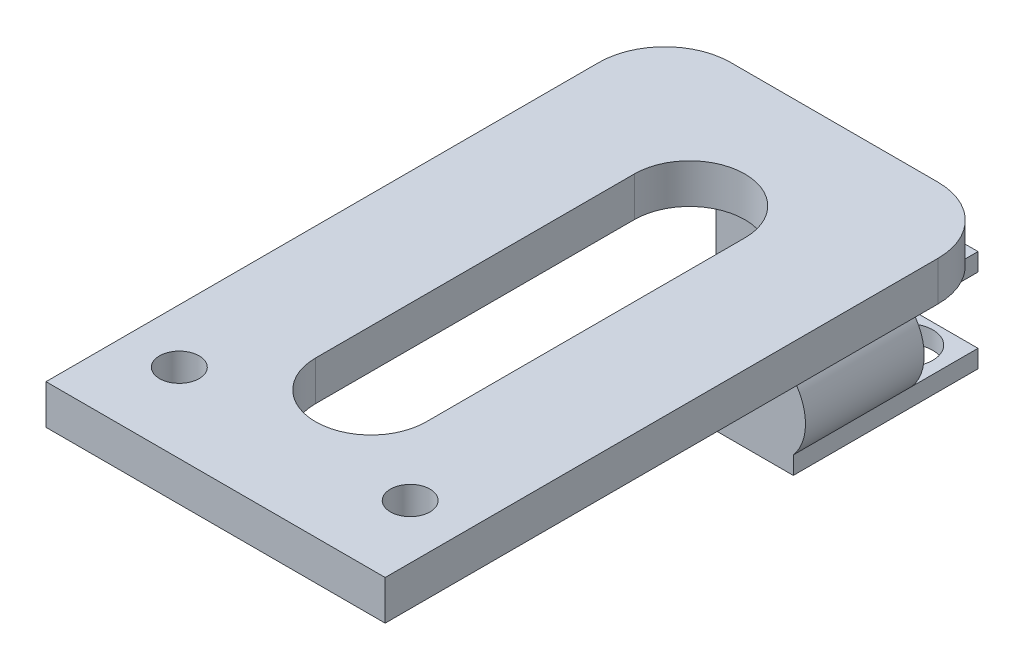
ISO-10303-21;
HEADER;
FILE_DESCRIPTION(('STEP AP214'),'2;1');
FILE_NAME('part.step','',(''),(''),'','','');
FILE_SCHEMA(('AUTOMOTIVE_DESIGN { 1 0 10303 214 1 1 1 1 }'));
ENDSEC;
DATA;
#1=APPLICATION_CONTEXT('core data for automotive mechanical design processes');
#2=APPLICATION_PROTOCOL_DEFINITION('international standard','automotive_design',2000,#1);
#3=PRODUCT_CONTEXT('',#1,'mechanical');
#4=PRODUCT('Part','Part','',(#3));
#5=PRODUCT_RELATED_PRODUCT_CATEGORY('part','',(#4));
#6=PRODUCT_DEFINITION_FORMATION('','',#4);
#7=PRODUCT_DEFINITION_CONTEXT('part definition',#1,'design');
#8=PRODUCT_DEFINITION('design','',#6,#7);
#9=PRODUCT_DEFINITION_SHAPE('','',#8);
#10=(LENGTH_UNIT() NAMED_UNIT(*) SI_UNIT(.MILLI.,.METRE.));
#11=(NAMED_UNIT(*) PLANE_ANGLE_UNIT() SI_UNIT($,.RADIAN.));
#12=(NAMED_UNIT(*) SI_UNIT($,.STERADIAN.) SOLID_ANGLE_UNIT());
#13=UNCERTAINTY_MEASURE_WITH_UNIT(LENGTH_MEASURE(1.E-05),#10,'distance_accuracy_value','');
#14=(GEOMETRIC_REPRESENTATION_CONTEXT(3) GLOBAL_UNCERTAINTY_ASSIGNED_CONTEXT((#13)) GLOBAL_UNIT_ASSIGNED_CONTEXT((#10,
#11,#12)) REPRESENTATION_CONTEXT('',''));
#15=CARTESIAN_POINT('',(0.,0.,0.));
#16=DIRECTION('',(0.,0.,1.));
#17=DIRECTION('',(1.,0.,0.));
#18=AXIS2_PLACEMENT_3D('',#15,#16,#17);
#19=CARTESIAN_POINT('',(2.92617170234072,11.,10.));
#20=DIRECTION('',(0.,-1.,0.));
#21=DIRECTION('',(0.,0.,-1.));
#22=AXIS2_PLACEMENT_3D('',#19,#20,#21);
#23=PLANE('',#22);
#24=CARTESIAN_POINT('',(0.,11.,2.5));
#25=DIRECTION('',(0.,1.,0.));
#26=DIRECTION('',(0.,0.,1.));
#27=AXIS2_PLACEMENT_3D('',#24,#25,#26);
#28=CIRCLE('',#27,2.);
#29=CARTESIAN_POINT('',(0.,11.,4.5));
#30=VERTEX_POINT('',#29);
#31=EDGE_CURVE('E304',#30,#30,#28,.T.);
#32=ORIENTED_EDGE('',*,*,#31,.F.);
#33=EDGE_LOOP('',(#32));
#34=FACE_BOUND('',#33,.T.);
#35=DIRECTION('',(-1.,0.,0.));
#36=VECTOR('',#35,1.);
#37=CARTESIAN_POINT('',(2.92617170234072,11.,9.));
#38=LINE('',#37,#36);
#39=CARTESIAN_POINT('',(2.92617170234072,11.,9.));
#40=VERTEX_POINT('',#39);
#41=CARTESIAN_POINT('',(-2.92617170234077,11.,9.));
#42=VERTEX_POINT('',#41);
#43=EDGE_CURVE('E33',#40,#42,#38,.T.);
#44=ORIENTED_EDGE('',*,*,#43,.F.);
#45=DIRECTION('',(0.,0.,-1.));
#46=VECTOR('',#45,1.);
#47=CARTESIAN_POINT('',(2.92617170234072,11.,10.));
#48=LINE('',#47,#46);
#49=CARTESIAN_POINT('',(2.92617170234072,11.,0.));
#50=VERTEX_POINT('',#49);
#51=EDGE_CURVE('E364',#40,#50,#48,.T.);
#52=ORIENTED_EDGE('',*,*,#51,.T.);
#53=DIRECTION('',(-1.,0.,0.));
#54=VECTOR('',#53,1.);
#55=CARTESIAN_POINT('',(2.92617170234072,11.,0.));
#56=LINE('',#55,#54);
#57=CARTESIAN_POINT('',(-2.92617170234077,11.,0.));
#58=VERTEX_POINT('',#57);
#59=EDGE_CURVE('E359',#50,#58,#56,.T.);
#60=ORIENTED_EDGE('',*,*,#59,.T.);
#61=DIRECTION('',(0.,0.,-1.));
#62=VECTOR('',#61,1.);
#63=CARTESIAN_POINT('',(-2.92617170234077,11.,10.));
#64=LINE('',#63,#62);
#65=EDGE_CURVE('E362',#42,#58,#64,.T.);
#66=ORIENTED_EDGE('',*,*,#65,.F.);
#67=EDGE_LOOP('',(#44,#52,#60,#66));
#68=FACE_BOUND('',#67,.T.);
#69=ADVANCED_FACE('F17',(#34,#68),#23,.F.);
#70=CARTESIAN_POINT('',(-2.92617170234077,11.,10.));
#71=DIRECTION('',(1.,0.,0.));
#72=DIRECTION('',(0.,1.,0.));
#73=AXIS2_PLACEMENT_3D('',#70,#71,#72);
#74=PLANE('',#73);
#75=DIRECTION('',(0.,-1.,0.));
#76=VECTOR('',#75,1.);
#77=CARTESIAN_POINT('',(-2.92617170234077,11.,0.));
#78=LINE('',#77,#76);
#79=CARTESIAN_POINT('',(-2.92617170234077,9.65200303125719,0.));
#80=VERTEX_POINT('',#79);
#81=EDGE_CURVE('E350',#58,#80,#78,.T.);
#82=ORIENTED_EDGE('',*,*,#81,.T.);
#83=DIRECTION('',(0.,0.,-1.));
#84=VECTOR('',#83,1.);
#85=CARTESIAN_POINT('',(-2.92617170234077,9.65200303125719,10.));
#86=LINE('',#85,#84);
#87=CARTESIAN_POINT('',(-2.92617170234077,9.65200303125719,5.));
#88=VERTEX_POINT('',#87);
#89=EDGE_CURVE('E26',#88,#80,#86,.T.);
#90=ORIENTED_EDGE('',*,*,#89,.F.);
#91=CARTESIAN_POINT('',(-2.92617170234077,9.65200303125719,14.));
#92=VERTEX_POINT('',#91);
#93=EDGE_CURVE('E11',#92,#88,#86,.T.);
#94=ORIENTED_EDGE('',*,*,#93,.F.);
#95=DIRECTION('',(0.,-1.,0.));
#96=VECTOR('',#95,1.);
#97=CARTESIAN_POINT('',(-2.92617170234078,0.,14.));
#98=LINE('',#97,#96);
#99=CARTESIAN_POINT('',(-2.92617170234077,19.,14.));
#100=VERTEX_POINT('',#99);
#101=EDGE_CURVE('E283',#100,#92,#98,.T.);
#102=ORIENTED_EDGE('',*,*,#101,.F.);
#103=DIRECTION('',(0.,0.,1.));
#104=VECTOR('',#103,1.);
#105=CARTESIAN_POINT('',(-2.92617170234077,19.,14.));
#106=LINE('',#105,#104);
#107=CARTESIAN_POINT('',(-2.92617170234077,19.,9.));
#108=VERTEX_POINT('',#107);
#109=EDGE_CURVE('E270',#108,#100,#106,.T.);
#110=ORIENTED_EDGE('',*,*,#109,.F.);
#111=DIRECTION('',(0.,-1.,0.));
#112=VECTOR('',#111,1.);
#113=CARTESIAN_POINT('',(-2.92617170234077,19.,9.));
#114=LINE('',#113,#112);
#115=EDGE_CURVE('E276',#108,#42,#114,.T.);
#116=ORIENTED_EDGE('',*,*,#115,.T.);
#117=ORIENTED_EDGE('',*,*,#65,.T.);
#118=EDGE_LOOP('',(#82,#90,#94,#102,#110,#116,#117));
#119=FACE_BOUND('',#118,.T.);
#120=ADVANCED_FACE('F19',(#119),#74,.F.);
#121=CARTESIAN_POINT('',(-2.92617170234077,9.65200303125719,10.));
#122=DIRECTION('',(0.,1.,0.));
#123=DIRECTION('',(0.,0.,1.));
#124=AXIS2_PLACEMENT_3D('',#121,#122,#123);
#125=PLANE('',#124);
#126=CARTESIAN_POINT('',(0.,9.65200303125719,2.5));
#127=DIRECTION('',(0.,1.,0.));
#128=DIRECTION('',(0.,0.,1.));
#129=AXIS2_PLACEMENT_3D('',#126,#127,#128);
#130=CIRCLE('',#129,2.);
#131=CARTESIAN_POINT('',(0.,9.65200303125719,4.5));
#132=VERTEX_POINT('',#131);
#133=EDGE_CURVE('E310',#132,#132,#130,.T.);
#134=ORIENTED_EDGE('',*,*,#133,.T.);
#135=EDGE_LOOP('',(#134));
#136=FACE_BOUND('',#135,.T.);
#137=DIRECTION('',(0.,0.,-1.));
#138=VECTOR('',#137,1.);
#139=CARTESIAN_POINT('',(2.92617170234072,9.65200303125719,10.));
#140=LINE('',#139,#138);
#141=CARTESIAN_POINT('',(2.92617170234072,9.65200303125719,5.));
#142=VERTEX_POINT('',#141);
#143=CARTESIAN_POINT('',(2.92617170234072,9.65200303125719,0.));
#144=VERTEX_POINT('',#143);
#145=EDGE_CURVE('E366',#142,#144,#140,.T.);
#146=ORIENTED_EDGE('',*,*,#145,.F.);
#147=DIRECTION('',(-1.,0.,0.));
#148=VECTOR('',#147,1.);
#149=CARTESIAN_POINT('',(2.92617170234072,9.65200303125719,5.));
#150=LINE('',#149,#148);
#151=EDGE_CURVE('E337',#142,#88,#150,.T.);
#152=ORIENTED_EDGE('',*,*,#151,.T.);
#153=ORIENTED_EDGE('',*,*,#89,.T.);
#154=DIRECTION('',(1.,0.,0.));
#155=VECTOR('',#154,1.);
#156=CARTESIAN_POINT('',(-2.92617170234077,9.65200303125719,0.));
#157=LINE('',#156,#155);
#158=EDGE_CURVE('E353',#80,#144,#157,.T.);
#159=ORIENTED_EDGE('',*,*,#158,.T.);
#160=EDGE_LOOP('',(#146,#152,#153,#159));
#161=FACE_BOUND('',#160,.T.);
#162=ADVANCED_FACE('F377',(#136,#161),#125,.F.);
#163=CARTESIAN_POINT('',(2.92617170234072,9.65200303125719,10.));
#164=DIRECTION('',(-1.,0.,0.));
#165=DIRECTION('',(0.,0.,1.));
#166=AXIS2_PLACEMENT_3D('',#163,#164,#165);
#167=PLANE('',#166);
#168=DIRECTION('',(0.,1.,0.));
#169=VECTOR('',#168,1.);
#170=CARTESIAN_POINT('',(2.92617170234072,9.65200303125719,0.));
#171=LINE('',#170,#169);
#172=EDGE_CURVE('E356',#144,#50,#171,.T.);
#173=ORIENTED_EDGE('',*,*,#172,.T.);
#174=ORIENTED_EDGE('',*,*,#51,.F.);
#175=DIRECTION('',(0.,-1.,0.));
#176=VECTOR('',#175,1.);
#177=CARTESIAN_POINT('',(2.92617170234072,19.,9.));
#178=LINE('',#177,#176);
#179=CARTESIAN_POINT('',(2.92617170234072,19.,9.));
#180=VERTEX_POINT('',#179);
#181=EDGE_CURVE('E280',#180,#40,#178,.T.);
#182=ORIENTED_EDGE('',*,*,#181,.F.);
#183=DIRECTION('',(0.,0.,-1.));
#184=VECTOR('',#183,1.);
#185=CARTESIAN_POINT('',(2.92617170234072,19.,14.));
#186=LINE('',#185,#184);
#187=CARTESIAN_POINT('',(2.92617170234072,19.,14.));
#188=VERTEX_POINT('',#187);
#189=EDGE_CURVE('E264',#188,#180,#186,.T.);
#190=ORIENTED_EDGE('',*,*,#189,.F.);
#191=DIRECTION('',(0.,1.,0.));
#192=VECTOR('',#191,1.);
#193=CARTESIAN_POINT('',(2.92617170234072,0.,14.));
#194=LINE('',#193,#192);
#195=CARTESIAN_POINT('',(2.92617170234072,9.65200303125719,14.));
#196=VERTEX_POINT('',#195);
#197=EDGE_CURVE('E301',#196,#188,#194,.T.);
#198=ORIENTED_EDGE('',*,*,#197,.F.);
#199=EDGE_CURVE('E367',#196,#142,#140,.T.);
#200=ORIENTED_EDGE('',*,*,#199,.T.);
#201=ORIENTED_EDGE('',*,*,#145,.T.);
#202=EDGE_LOOP('',(#173,#174,#182,#190,#198,#200,#201));
#203=FACE_BOUND('',#202,.T.);
#204=ADVANCED_FACE('F372',(#203),#167,.F.);
#205=CARTESIAN_POINT('',(0.,0.,0.));
#206=DIRECTION('',(0.,0.,1.));
#207=DIRECTION('',(1.,0.,0.));
#208=AXIS2_PLACEMENT_3D('',#205,#206,#207);
#209=PLANE('',#208);
#210=ORIENTED_EDGE('',*,*,#81,.F.);
#211=ORIENTED_EDGE('',*,*,#59,.F.);
#212=ORIENTED_EDGE('',*,*,#172,.F.);
#213=ORIENTED_EDGE('',*,*,#158,.F.);
#214=EDGE_LOOP('',(#210,#211,#212,#213));
#215=FACE_BOUND('',#214,.T.);
#216=ADVANCED_FACE('F381',(#215),#209,.F.);
#217=CARTESIAN_POINT('',(0.,7.15,10.));
#218=DIRECTION('',(0.,0.,-1.));
#219=DIRECTION('',(-1.,0.,0.));
#220=AXIS2_PLACEMENT_3D('',#217,#218,#219);
#221=CYLINDRICAL_SURFACE('',#220,3.85);
#222=CARTESIAN_POINT('',(0.,7.15,5.));
#223=DIRECTION('',(0.,0.,1.));
#224=DIRECTION('',(1.,0.,0.));
#225=AXIS2_PLACEMENT_3D('',#222,#223,#224);
#226=CIRCLE('',#225,3.85);
#227=CARTESIAN_POINT('',(2.92617170234072,4.64799696874278,5.));
#228=VERTEX_POINT('',#227);
#229=EDGE_CURVE('E334',#228,#142,#226,.T.);
#230=ORIENTED_EDGE('',*,*,#229,.T.);
#231=ORIENTED_EDGE('',*,*,#199,.F.);
#232=CARTESIAN_POINT('',(0.,7.15,14.));
#233=DIRECTION('',(0.,0.,1.));
#234=DIRECTION('',(1.,0.,0.));
#235=AXIS2_PLACEMENT_3D('',#232,#233,#234);
#236=CIRCLE('',#235,3.85);
#237=CARTESIAN_POINT('',(2.92617170234072,4.64799696874278,14.));
#238=VERTEX_POINT('',#237);
#239=EDGE_CURVE('E298',#238,#196,#236,.T.);
#240=ORIENTED_EDGE('',*,*,#239,.F.);
#241=DIRECTION('',(0.,0.,-1.));
#242=VECTOR('',#241,1.);
#243=CARTESIAN_POINT('',(2.92617170234072,4.64799696874278,10.));
#244=LINE('',#243,#242);
#245=EDGE_CURVE('E344',#238,#228,#244,.T.);
#246=ORIENTED_EDGE('',*,*,#245,.T.);
#247=EDGE_LOOP('',(#230,#231,#240,#246));
#248=FACE_BOUND('',#247,.T.);
#249=ADVANCED_FACE('F394',(#248),#221,.T.);
#250=CARTESIAN_POINT('',(0.,7.15,10.));
#251=DIRECTION('',(0.,0.,-1.));
#252=DIRECTION('',(-1.,0.,0.));
#253=AXIS2_PLACEMENT_3D('',#250,#251,#252);
#254=CYLINDRICAL_SURFACE('',#253,3.85);
#255=CARTESIAN_POINT('',(0.,7.15,5.));
#256=DIRECTION('',(0.,0.,1.));
#257=DIRECTION('',(1.,0.,0.));
#258=AXIS2_PLACEMENT_3D('',#255,#256,#257);
#259=CIRCLE('',#258,3.85);
#260=CARTESIAN_POINT('',(-2.92617170234078,4.64799696874278,5.));
#261=VERTEX_POINT('',#260);
#262=EDGE_CURVE('E41',#88,#261,#259,.T.);
#263=ORIENTED_EDGE('',*,*,#262,.T.);
#264=DIRECTION('',(0.,0.,-1.));
#265=VECTOR('',#264,1.);
#266=CARTESIAN_POINT('',(-2.92617170234078,4.64799696874278,10.));
#267=LINE('',#266,#265);
#268=CARTESIAN_POINT('',(-2.92617170234077,4.64799696874278,14.));
#269=VERTEX_POINT('',#268);
#270=EDGE_CURVE('E347',#269,#261,#267,.T.);
#271=ORIENTED_EDGE('',*,*,#270,.F.);
#272=CARTESIAN_POINT('',(0.,7.15,14.));
#273=DIRECTION('',(0.,0.,1.));
#274=DIRECTION('',(1.,0.,0.));
#275=AXIS2_PLACEMENT_3D('',#272,#273,#274);
#276=CIRCLE('',#275,3.85);
#277=EDGE_CURVE('E286',#92,#269,#276,.T.);
#278=ORIENTED_EDGE('',*,*,#277,.F.);
#279=ORIENTED_EDGE('',*,*,#93,.T.);
#280=EDGE_LOOP('',(#263,#271,#278,#279));
#281=FACE_BOUND('',#280,.T.);
#282=ADVANCED_FACE('F401',(#281),#254,.T.);
#283=CARTESIAN_POINT('',(0.,7.15,5.));
#284=DIRECTION('',(0.,0.,1.));
#285=DIRECTION('',(1.,0.,0.));
#286=AXIS2_PLACEMENT_3D('',#283,#284,#285);
#287=PLANE('',#286);
#288=ORIENTED_EDGE('',*,*,#229,.F.);
#289=DIRECTION('',(1.,0.,0.));
#290=VECTOR('',#289,1.);
#291=CARTESIAN_POINT('',(-2.92617170234078,4.64799696874278,5.));
#292=LINE('',#291,#290);
#293=EDGE_CURVE('E341',#261,#228,#292,.T.);
#294=ORIENTED_EDGE('',*,*,#293,.F.);
#295=ORIENTED_EDGE('',*,*,#262,.F.);
#296=ORIENTED_EDGE('',*,*,#151,.F.);
#297=EDGE_LOOP('',(#288,#294,#295,#296));
#298=FACE_BOUND('',#297,.T.);
#299=ADVANCED_FACE('F395',(#298),#287,.F.);
#300=CARTESIAN_POINT('',(2.92617170234072,4.64799696874278,10.));
#301=DIRECTION('',(0.,-1.,0.));
#302=DIRECTION('',(1.,0.,0.));
#303=AXIS2_PLACEMENT_3D('',#300,#301,#302);
#304=PLANE('',#303);
#305=CARTESIAN_POINT('',(0.,4.64799696874278,2.5));
#306=DIRECTION('',(0.,-1.,0.));
#307=DIRECTION('',(1.,0.,0.));
#308=AXIS2_PLACEMENT_3D('',#305,#306,#307);
#309=CIRCLE('',#308,2.);
#310=CARTESIAN_POINT('',(1.99999999999998,4.64799696874278,2.5));
#311=VERTEX_POINT('',#310);
#312=EDGE_CURVE('E307',#311,#311,#309,.T.);
#313=ORIENTED_EDGE('',*,*,#312,.T.);
#314=EDGE_LOOP('',(#313));
#315=FACE_BOUND('',#314,.T.);
#316=DIRECTION('',(0.,0.,-1.));
#317=VECTOR('',#316,1.);
#318=CARTESIAN_POINT('',(-2.92617170234077,4.64799696874278,10.));
#319=LINE('',#318,#317);
#320=CARTESIAN_POINT('',(-2.92617170234077,4.64799696874278,0.));
#321=VERTEX_POINT('',#320);
#322=EDGE_CURVE('E324',#261,#321,#319,.T.);
#323=ORIENTED_EDGE('',*,*,#322,.F.);
#324=ORIENTED_EDGE('',*,*,#293,.T.);
#325=DIRECTION('',(0.,0.,-1.));
#326=VECTOR('',#325,1.);
#327=CARTESIAN_POINT('',(2.92617170234072,4.64799696874278,10.));
#328=LINE('',#327,#326);
#329=CARTESIAN_POINT('',(2.92617170234072,4.64799696874278,0.));
#330=VERTEX_POINT('',#329);
#331=EDGE_CURVE('E326',#228,#330,#328,.T.);
#332=ORIENTED_EDGE('',*,*,#331,.T.);
#333=DIRECTION('',(-1.,0.,0.));
#334=VECTOR('',#333,1.);
#335=CARTESIAN_POINT('',(2.92617170234072,4.64799696874278,0.));
#336=LINE('',#335,#334);
#337=EDGE_CURVE('E321',#330,#321,#336,.T.);
#338=ORIENTED_EDGE('',*,*,#337,.T.);
#339=EDGE_LOOP('',(#323,#324,#332,#338));
#340=FACE_BOUND('',#339,.T.);
#341=ADVANCED_FACE('F416',(#315,#340),#304,.F.);
#342=CARTESIAN_POINT('',(-2.92617170234077,4.64799696874278,10.));
#343=DIRECTION('',(1.,0.,0.));
#344=DIRECTION('',(0.,0.,-1.));
#345=AXIS2_PLACEMENT_3D('',#342,#343,#344);
#346=PLANE('',#345);
#347=DIRECTION('',(0.,-1.,0.));
#348=VECTOR('',#347,1.);
#349=CARTESIAN_POINT('',(-2.92617170234077,4.64799696874278,0.));
#350=LINE('',#349,#348);
#351=CARTESIAN_POINT('',(-2.92617170234077,3.3,0.));
#352=VERTEX_POINT('',#351);
#353=EDGE_CURVE('E313',#321,#352,#350,.T.);
#354=ORIENTED_EDGE('',*,*,#353,.T.);
#355=DIRECTION('',(0.,0.,-1.));
#356=VECTOR('',#355,1.);
#357=CARTESIAN_POINT('',(-2.92617170234077,3.3,10.));
#358=LINE('',#357,#356);
#359=CARTESIAN_POINT('',(-2.92617170234077,3.3,14.));
#360=VERTEX_POINT('',#359);
#361=EDGE_CURVE('E331',#360,#352,#358,.T.);
#362=ORIENTED_EDGE('',*,*,#361,.F.);
#363=DIRECTION('',(0.,-1.,0.));
#364=VECTOR('',#363,1.);
#365=CARTESIAN_POINT('',(-2.92617170234077,0.,14.));
#366=LINE('',#365,#364);
#367=EDGE_CURVE('E289',#269,#360,#366,.T.);
#368=ORIENTED_EDGE('',*,*,#367,.F.);
#369=ORIENTED_EDGE('',*,*,#270,.T.);
#370=ORIENTED_EDGE('',*,*,#322,.T.);
#371=EDGE_LOOP('',(#354,#362,#368,#369,#370));
#372=FACE_BOUND('',#371,.T.);
#373=ADVANCED_FACE('F403',(#372),#346,.F.);
#374=CARTESIAN_POINT('',(-2.92617170234077,3.3,10.));
#375=DIRECTION('',(0.,1.,0.));
#376=DIRECTION('',(0.,0.,1.));
#377=AXIS2_PLACEMENT_3D('',#374,#375,#376);
#378=PLANE('',#377);
#379=CARTESIAN_POINT('',(0.,3.3,2.5));
#380=DIRECTION('',(0.,1.,0.));
#381=DIRECTION('',(0.,0.,1.));
#382=AXIS2_PLACEMENT_3D('',#379,#380,#381);
#383=CIRCLE('',#382,2.);
#384=CARTESIAN_POINT('',(0.,3.3,4.5));
#385=VERTEX_POINT('',#384);
#386=EDGE_CURVE('E21',#385,#385,#383,.T.);
#387=ORIENTED_EDGE('',*,*,#386,.T.);
#388=EDGE_LOOP('',(#387));
#389=FACE_BOUND('',#388,.T.);
#390=DIRECTION('',(1.,0.,0.));
#391=VECTOR('',#390,1.);
#392=CARTESIAN_POINT('',(-2.92617170234077,3.3,0.));
#393=LINE('',#392,#391);
#394=CARTESIAN_POINT('',(2.92617170234072,3.3,0.));
#395=VERTEX_POINT('',#394);
#396=EDGE_CURVE('E316',#352,#395,#393,.T.);
#397=ORIENTED_EDGE('',*,*,#396,.T.);
#398=DIRECTION('',(0.,0.,-1.));
#399=VECTOR('',#398,1.);
#400=CARTESIAN_POINT('',(2.92617170234072,3.3,10.));
#401=LINE('',#400,#399);
#402=CARTESIAN_POINT('',(2.92617170234072,3.3,14.));
#403=VERTEX_POINT('',#402);
#404=EDGE_CURVE('E328',#403,#395,#401,.T.);
#405=ORIENTED_EDGE('',*,*,#404,.F.);
#406=DIRECTION('',(1.,0.,0.));
#407=VECTOR('',#406,1.);
#408=CARTESIAN_POINT('',(0.,3.3,14.));
#409=LINE('',#408,#407);
#410=EDGE_CURVE('E292',#360,#403,#409,.T.);
#411=ORIENTED_EDGE('',*,*,#410,.F.);
#412=ORIENTED_EDGE('',*,*,#361,.T.);
#413=EDGE_LOOP('',(#397,#405,#411,#412));
#414=FACE_BOUND('',#413,.T.);
#415=ADVANCED_FACE('F406',(#389,#414),#378,.F.);
#416=CARTESIAN_POINT('',(2.92617170234072,3.3,10.));
#417=DIRECTION('',(-1.,0.,0.));
#418=DIRECTION('',(0.,0.,1.));
#419=AXIS2_PLACEMENT_3D('',#416,#417,#418);
#420=PLANE('',#419);
#421=DIRECTION('',(0.,1.,0.));
#422=VECTOR('',#421,1.);
#423=CARTESIAN_POINT('',(2.92617170234072,3.3,0.));
#424=LINE('',#423,#422);
#425=EDGE_CURVE('E318',#395,#330,#424,.T.);
#426=ORIENTED_EDGE('',*,*,#425,.T.);
#427=ORIENTED_EDGE('',*,*,#331,.F.);
#428=ORIENTED_EDGE('',*,*,#245,.F.);
#429=DIRECTION('',(0.,1.,0.));
#430=VECTOR('',#429,1.);
#431=CARTESIAN_POINT('',(2.92617170234072,0.,14.));
#432=LINE('',#431,#430);
#433=EDGE_CURVE('E295',#403,#238,#432,.T.);
#434=ORIENTED_EDGE('',*,*,#433,.F.);
#435=ORIENTED_EDGE('',*,*,#404,.T.);
#436=EDGE_LOOP('',(#426,#427,#428,#434,#435));
#437=FACE_BOUND('',#436,.T.);
#438=ADVANCED_FACE('F409',(#437),#420,.F.);
#439=CARTESIAN_POINT('',(0.,0.,0.));
#440=DIRECTION('',(0.,0.,1.));
#441=DIRECTION('',(1.,0.,0.));
#442=AXIS2_PLACEMENT_3D('',#439,#440,#441);
#443=PLANE('',#442);
#444=ORIENTED_EDGE('',*,*,#353,.F.);
#445=ORIENTED_EDGE('',*,*,#337,.F.);
#446=ORIENTED_EDGE('',*,*,#425,.F.);
#447=ORIENTED_EDGE('',*,*,#396,.F.);
#448=EDGE_LOOP('',(#444,#445,#446,#447));
#449=FACE_BOUND('',#448,.T.);
#450=ADVANCED_FACE('F414',(#449),#443,.F.);
#451=CARTESIAN_POINT('',(0.,0.,2.5));
#452=DIRECTION('',(0.,1.,0.));
#453=DIRECTION('',(0.,0.,1.));
#454=AXIS2_PLACEMENT_3D('',#451,#452,#453);
#455=CYLINDRICAL_SURFACE('',#454,2.);
#456=ORIENTED_EDGE('',*,*,#386,.F.);
#457=EDGE_LOOP('',(#456));
#458=FACE_BOUND('',#457,.T.);
#459=ORIENTED_EDGE('',*,*,#312,.F.);
#460=EDGE_LOOP('',(#459));
#461=FACE_BOUND('',#460,.T.);
#462=ADVANCED_FACE('F448',(#458,#461),#455,.F.);
#463=ORIENTED_EDGE('',*,*,#31,.T.);
#464=EDGE_LOOP('',(#463));
#465=FACE_BOUND('',#464,.T.);
#466=ORIENTED_EDGE('',*,*,#133,.F.);
#467=EDGE_LOOP('',(#466));
#468=FACE_BOUND('',#467,.T.);
#469=ADVANCED_FACE('F446',(#465,#468),#455,.F.);
#470=CARTESIAN_POINT('',(0.,0.,14.));
#471=DIRECTION('',(0.,0.,1.));
#472=DIRECTION('',(1.,0.,0.));
#473=AXIS2_PLACEMENT_3D('',#470,#471,#472);
#474=PLANE('',#473);
#475=ORIENTED_EDGE('',*,*,#197,.T.);
#476=DIRECTION('',(1.,0.,0.));
#477=VECTOR('',#476,1.);
#478=CARTESIAN_POINT('',(2.92617170234072,19.,14.));
#479=LINE('',#478,#477);
#480=EDGE_CURVE('E273',#100,#188,#479,.T.);
#481=ORIENTED_EDGE('',*,*,#480,.F.);
#482=ORIENTED_EDGE('',*,*,#101,.T.);
#483=ORIENTED_EDGE('',*,*,#277,.T.);
#484=ORIENTED_EDGE('',*,*,#367,.T.);
#485=ORIENTED_EDGE('',*,*,#410,.T.);
#486=ORIENTED_EDGE('',*,*,#433,.T.);
#487=ORIENTED_EDGE('',*,*,#239,.T.);
#488=EDGE_LOOP('',(#475,#481,#482,#483,#484,#485,#486,#487));
#489=FACE_BOUND('',#488,.T.);
#490=ADVANCED_FACE('F390',(#489),#474,.T.);
#491=CARTESIAN_POINT('',(2.92617170234072,19.,9.));
#492=DIRECTION('',(0.,0.,1.));
#493=DIRECTION('',(1.,0.,0.));
#494=AXIS2_PLACEMENT_3D('',#491,#492,#493);
#495=PLANE('',#494);
#496=ORIENTED_EDGE('',*,*,#43,.T.);
#497=ORIENTED_EDGE('',*,*,#115,.F.);
#498=DIRECTION('',(-1.,0.,0.));
#499=VECTOR('',#498,1.);
#500=CARTESIAN_POINT('',(2.92617170234072,19.,9.));
#501=LINE('',#500,#499);
#502=EDGE_CURVE('E267',#180,#108,#501,.T.);
#503=ORIENTED_EDGE('',*,*,#502,.F.);
#504=ORIENTED_EDGE('',*,*,#181,.T.);
#505=EDGE_LOOP('',(#496,#497,#503,#504));
#506=FACE_BOUND('',#505,.T.);
#507=ADVANCED_FACE('F384',(#506),#495,.F.);
#508=CARTESIAN_POINT('',(-7.85477062396012,19.,12.9614069123011));
#509=DIRECTION('',(0.,1.,0.));
#510=DIRECTION('',(0.,0.,1.));
#511=AXIS2_PLACEMENT_3D('',#508,#509,#510);
#512=PLANE('',#511);
#513=CARTESIAN_POINT('',(8.75,19.,48.8636338071119));
#514=DIRECTION('',(0.,1.,0.));
#515=DIRECTION('',(0.,0.,1.));
#516=AXIS2_PLACEMENT_3D('',#513,#514,#515);
#517=CIRCLE('',#516,1.5);
#518=CARTESIAN_POINT('',(8.75,19.,50.3636338071119));
#519=VERTEX_POINT('',#518);
#520=EDGE_CURVE('E185',#519,#519,#517,.T.);
#521=ORIENTED_EDGE('',*,*,#520,.T.);
#522=EDGE_LOOP('',(#521));
#523=FACE_BOUND('',#522,.T.);
#524=CARTESIAN_POINT('',(-8.75,19.,48.8636338071119));
#525=DIRECTION('',(0.,1.,0.));
#526=DIRECTION('',(0.,0.,1.));
#527=AXIS2_PLACEMENT_3D('',#524,#525,#526);
#528=CIRCLE('',#527,1.5);
#529=CARTESIAN_POINT('',(-8.75,19.,50.3636338071119));
#530=VERTEX_POINT('',#529);
#531=EDGE_CURVE('E212',#530,#530,#528,.T.);
#532=ORIENTED_EDGE('',*,*,#531,.T.);
#533=EDGE_LOOP('',(#532));
#534=FACE_BOUND('',#533,.T.);
#535=DIRECTION('',(0.,0.,1.));
#536=VECTOR('',#535,1.);
#537=CARTESIAN_POINT('',(-12.8547706239601,19.,54.8645872609228));
#538=LINE('',#537,#536);
#539=CARTESIAN_POINT('',(-12.8547706239601,19.,12.9614069123011));
#540=VERTEX_POINT('',#539);
#541=CARTESIAN_POINT('',(-12.8547706239601,19.,54.8645872609228));
#542=VERTEX_POINT('',#541);
#543=EDGE_CURVE('E218',#540,#542,#538,.T.);
#544=ORIENTED_EDGE('',*,*,#543,.F.);
#545=CARTESIAN_POINT('',(-7.85477062396012,19.,12.9614069123011));
#546=DIRECTION('',(0.,1.,0.));
#547=DIRECTION('',(0.,0.,1.));
#548=AXIS2_PLACEMENT_3D('',#545,#546,#547);
#549=CIRCLE('',#548,5.);
#550=CARTESIAN_POINT('',(-7.85477062396009,19.,7.96140691230107));
#551=VERTEX_POINT('',#550);
#552=EDGE_CURVE('E225',#551,#540,#549,.T.);
#553=ORIENTED_EDGE('',*,*,#552,.F.);
#554=DIRECTION('',(-1.,0.,0.));
#555=VECTOR('',#554,1.);
#556=CARTESIAN_POINT('',(-7.85477062396009,19.,7.96140691230107));
#557=LINE('',#556,#555);
#558=CARTESIAN_POINT('',(7.85477062396009,19.,7.96140691230107));
#559=VERTEX_POINT('',#558);
#560=EDGE_CURVE('E244',#559,#551,#557,.T.);
#561=ORIENTED_EDGE('',*,*,#560,.F.);
#562=CARTESIAN_POINT('',(7.85477062396013,19.,12.9614069123011));
#563=DIRECTION('',(0.,1.,0.));
#564=DIRECTION('',(0.,0.,1.));
#565=AXIS2_PLACEMENT_3D('',#562,#563,#564);
#566=CIRCLE('',#565,5.);
#567=CARTESIAN_POINT('',(12.8547706239601,19.,12.9614069123011));
#568=VERTEX_POINT('',#567);
#569=EDGE_CURVE('E242',#568,#559,#566,.T.);
#570=ORIENTED_EDGE('',*,*,#569,.F.);
#571=DIRECTION('',(0.,0.,-1.));
#572=VECTOR('',#571,1.);
#573=CARTESIAN_POINT('',(12.8547706239601,19.,54.8645872609228));
#574=LINE('',#573,#572);
#575=CARTESIAN_POINT('',(12.8547706239601,19.,54.8645872609228));
#576=VERTEX_POINT('',#575);
#577=EDGE_CURVE('E240',#576,#568,#574,.T.);
#578=ORIENTED_EDGE('',*,*,#577,.F.);
#579=DIRECTION('',(1.,0.,0.));
#580=VECTOR('',#579,1.);
#581=CARTESIAN_POINT('',(-12.8547706239601,19.,54.8645872609228));
#582=LINE('',#581,#580);
#583=EDGE_CURVE('E238',#542,#576,#582,.T.);
#584=ORIENTED_EDGE('',*,*,#583,.F.);
#585=EDGE_LOOP('',(#544,#553,#561,#570,#578,#584));
#586=FACE_BOUND('',#585,.T.);
#587=CARTESIAN_POINT('',(0.,19.,43.0876563533289));
#588=DIRECTION('',(0.,1.,0.));
#589=DIRECTION('',(0.,0.,1.));
#590=AXIS2_PLACEMENT_3D('',#587,#588,#589);
#591=CIRCLE('',#590,4.19319018105213);
#592=CARTESIAN_POINT('',(-4.19319018105213,19.,43.0876563533289));
#593=VERTEX_POINT('',#592);
#594=CARTESIAN_POINT('',(4.19319018105213,19.,43.0876563533289));
#595=VERTEX_POINT('',#594);
#596=EDGE_CURVE('E197',#593,#595,#591,.T.);
#597=ORIENTED_EDGE('',*,*,#596,.T.);
#598=DIRECTION('',(0.,0.,-1.));
#599=VECTOR('',#598,1.);
#600=CARTESIAN_POINT('',(4.19319018105213,19.,43.0876563533289));
#601=LINE('',#600,#599);
#602=CARTESIAN_POINT('',(4.19319018105213,19.,18.935830148326));
#603=VERTEX_POINT('',#602);
#604=EDGE_CURVE('E184',#595,#603,#601,.T.);
#605=ORIENTED_EDGE('',*,*,#604,.T.);
#606=CARTESIAN_POINT('',(0.,19.,18.935830148326));
#607=DIRECTION('',(0.,1.,0.));
#608=DIRECTION('',(0.,0.,1.));
#609=AXIS2_PLACEMENT_3D('',#606,#607,#608);
#610=CIRCLE('',#609,4.19319018105213);
#611=CARTESIAN_POINT('',(-4.19319018105213,19.,18.935830148326));
#612=VERTEX_POINT('',#611);
#613=EDGE_CURVE('E200',#603,#612,#610,.T.);
#614=ORIENTED_EDGE('',*,*,#613,.T.);
#615=DIRECTION('',(0.,0.,1.));
#616=VECTOR('',#615,1.);
#617=CARTESIAN_POINT('',(-4.19319018105213,19.,43.0876563533289));
#618=LINE('',#617,#616);
#619=EDGE_CURVE('E178',#612,#593,#618,.T.);
#620=ORIENTED_EDGE('',*,*,#619,.T.);
#621=EDGE_LOOP('',(#597,#605,#614,#620));
#622=FACE_BOUND('',#621,.T.);
#623=ORIENTED_EDGE('',*,*,#480,.T.);
#624=ORIENTED_EDGE('',*,*,#189,.T.);
#625=ORIENTED_EDGE('',*,*,#502,.T.);
#626=ORIENTED_EDGE('',*,*,#109,.T.);
#627=EDGE_LOOP('',(#623,#624,#625,#626));
#628=FACE_BOUND('',#627,.T.);
#629=ADVANCED_FACE('F387',(#523,#534,#586,#622,#628),#512,.F.);
#630=CARTESIAN_POINT('',(-7.85477062396012,22.,12.9614069123011));
#631=DIRECTION('',(0.,1.,0.));
#632=DIRECTION('',(0.,0.,1.));
#633=AXIS2_PLACEMENT_3D('',#630,#631,#632);
#634=PLANE('',#633);
#635=CARTESIAN_POINT('',(-8.75,22.,48.8636338071119));
#636=DIRECTION('',(0.,1.,0.));
#637=DIRECTION('',(0.,0.,1.));
#638=AXIS2_PLACEMENT_3D('',#635,#636,#637);
#639=CIRCLE('',#638,1.5);
#640=CARTESIAN_POINT('',(-8.75,22.,50.3636338071119));
#641=VERTEX_POINT('',#640);
#642=EDGE_CURVE('E215',#641,#641,#639,.T.);
#643=ORIENTED_EDGE('',*,*,#642,.F.);
#644=EDGE_LOOP('',(#643));
#645=FACE_BOUND('',#644,.T.);
#646=DIRECTION('',(0.,0.,1.));
#647=VECTOR('',#646,1.);
#648=CARTESIAN_POINT('',(-12.8547706239601,22.,54.8645872609228));
#649=LINE('',#648,#647);
#650=CARTESIAN_POINT('',(-12.8547706239601,22.,12.9614069123011));
#651=VERTEX_POINT('',#650);
#652=CARTESIAN_POINT('',(-12.8547706239601,22.,54.8645872609228));
#653=VERTEX_POINT('',#652);
#654=EDGE_CURVE('E221',#651,#653,#649,.T.);
#655=ORIENTED_EDGE('',*,*,#654,.T.);
#656=DIRECTION('',(1.,0.,0.));
#657=VECTOR('',#656,1.);
#658=CARTESIAN_POINT('',(-12.8547706239601,22.,54.8645872609228));
#659=LINE('',#658,#657);
#660=CARTESIAN_POINT('',(12.8547706239601,22.,54.8645872609228));
#661=VERTEX_POINT('',#660);
#662=EDGE_CURVE('E224',#653,#661,#659,.T.);
#663=ORIENTED_EDGE('',*,*,#662,.T.);
#664=DIRECTION('',(0.,0.,-1.));
#665=VECTOR('',#664,1.);
#666=CARTESIAN_POINT('',(12.8547706239601,22.,54.8645872609228));
#667=LINE('',#666,#665);
#668=CARTESIAN_POINT('',(12.8547706239601,22.,12.9614069123011));
#669=VERTEX_POINT('',#668);
#670=EDGE_CURVE('E227',#661,#669,#667,.T.);
#671=ORIENTED_EDGE('',*,*,#670,.T.);
#672=CARTESIAN_POINT('',(7.85477062396013,22.,12.9614069123011));
#673=DIRECTION('',(0.,1.,0.));
#674=DIRECTION('',(0.,0.,1.));
#675=AXIS2_PLACEMENT_3D('',#672,#673,#674);
#676=CIRCLE('',#675,5.);
#677=CARTESIAN_POINT('',(7.85477062396009,22.,7.96140691230107));
#678=VERTEX_POINT('',#677);
#679=EDGE_CURVE('E229',#669,#678,#676,.T.);
#680=ORIENTED_EDGE('',*,*,#679,.T.);
#681=DIRECTION('',(-1.,0.,0.));
#682=VECTOR('',#681,1.);
#683=CARTESIAN_POINT('',(-7.85477062396009,22.,7.96140691230107));
#684=LINE('',#683,#682);
#685=CARTESIAN_POINT('',(-7.85477062396009,22.,7.96140691230107));
#686=VERTEX_POINT('',#685);
#687=EDGE_CURVE('E231',#678,#686,#684,.T.);
#688=ORIENTED_EDGE('',*,*,#687,.T.);
#689=CARTESIAN_POINT('',(-7.85477062396012,22.,12.9614069123011));
#690=DIRECTION('',(0.,1.,0.));
#691=DIRECTION('',(0.,0.,1.));
#692=AXIS2_PLACEMENT_3D('',#689,#690,#691);
#693=CIRCLE('',#692,5.);
#694=EDGE_CURVE('E233',#686,#651,#693,.T.);
#695=ORIENTED_EDGE('',*,*,#694,.T.);
#696=EDGE_LOOP('',(#655,#663,#671,#680,#688,#695));
#697=FACE_BOUND('',#696,.T.);
#698=CARTESIAN_POINT('',(8.75,22.,48.8636338071119));
#699=DIRECTION('',(0.,1.,0.));
#700=DIRECTION('',(0.,0.,1.));
#701=AXIS2_PLACEMENT_3D('',#698,#699,#700);
#702=CIRCLE('',#701,1.5);
#703=CARTESIAN_POINT('',(8.75,22.,50.3636338071119));
#704=VERTEX_POINT('',#703);
#705=EDGE_CURVE('E209',#704,#704,#702,.T.);
#706=ORIENTED_EDGE('',*,*,#705,.F.);
#707=EDGE_LOOP('',(#706));
#708=FACE_BOUND('',#707,.T.);
#709=DIRECTION('',(0.,0.,-1.));
#710=VECTOR('',#709,1.);
#711=CARTESIAN_POINT('',(4.19319018105213,22.,43.0876563533289));
#712=LINE('',#711,#710);
#713=CARTESIAN_POINT('',(4.19319018105213,22.,43.0876563533289));
#714=VERTEX_POINT('',#713);
#715=CARTESIAN_POINT('',(4.19319018105213,22.,18.935830148326));
#716=VERTEX_POINT('',#715);
#717=EDGE_CURVE('E177',#714,#716,#712,.T.);
#718=ORIENTED_EDGE('',*,*,#717,.F.);
#719=CARTESIAN_POINT('',(0.,22.,43.0876563533289));
#720=DIRECTION('',(0.,1.,0.));
#721=DIRECTION('',(0.,0.,1.));
#722=AXIS2_PLACEMENT_3D('',#719,#720,#721);
#723=CIRCLE('',#722,4.19319018105213);
#724=CARTESIAN_POINT('',(-4.19319018105213,22.,43.0876563533289));
#725=VERTEX_POINT('',#724);
#726=EDGE_CURVE('E167',#725,#714,#723,.T.);
#727=ORIENTED_EDGE('',*,*,#726,.F.);
#728=DIRECTION('',(0.,0.,1.));
#729=VECTOR('',#728,1.);
#730=CARTESIAN_POINT('',(-4.19319018105213,22.,43.0876563533289));
#731=LINE('',#730,#729);
#732=CARTESIAN_POINT('',(-4.19319018105213,22.,18.935830148326));
#733=VERTEX_POINT('',#732);
#734=EDGE_CURVE('E193',#733,#725,#731,.T.);
#735=ORIENTED_EDGE('',*,*,#734,.F.);
#736=CARTESIAN_POINT('',(0.,22.,18.935830148326));
#737=DIRECTION('',(0.,1.,0.));
#738=DIRECTION('',(0.,0.,1.));
#739=AXIS2_PLACEMENT_3D('',#736,#737,#738);
#740=CIRCLE('',#739,4.19319018105213);
#741=EDGE_CURVE('E191',#716,#733,#740,.T.);
#742=ORIENTED_EDGE('',*,*,#741,.F.);
#743=EDGE_LOOP('',(#718,#727,#735,#742));
#744=FACE_BOUND('',#743,.T.);
#745=ADVANCED_FACE('F189',(#645,#697,#708,#744),#634,.T.);
#746=CARTESIAN_POINT('',(-12.8547706239601,22.,54.8645872609228));
#747=DIRECTION('',(1.,0.,0.));
#748=DIRECTION('',(0.,0.,-1.));
#749=AXIS2_PLACEMENT_3D('',#746,#747,#748);
#750=PLANE('',#749);
#751=ORIENTED_EDGE('',*,*,#543,.T.);
#752=DIRECTION('',(0.,-1.,0.));
#753=VECTOR('',#752,1.);
#754=CARTESIAN_POINT('',(-12.8547706239601,22.,54.8645872609228));
#755=LINE('',#754,#753);
#756=EDGE_CURVE('E261',#653,#542,#755,.T.);
#757=ORIENTED_EDGE('',*,*,#756,.F.);
#758=ORIENTED_EDGE('',*,*,#654,.F.);
#759=DIRECTION('',(0.,-1.,0.));
#760=VECTOR('',#759,1.);
#761=CARTESIAN_POINT('',(-12.8547706239601,22.,12.9614069123011));
#762=LINE('',#761,#760);
#763=EDGE_CURVE('E235',#651,#540,#762,.T.);
#764=ORIENTED_EDGE('',*,*,#763,.T.);
#765=EDGE_LOOP('',(#751,#757,#758,#764));
#766=FACE_BOUND('',#765,.T.);
#767=ADVANCED_FACE('F574',(#766),#750,.F.);
#768=CARTESIAN_POINT('',(-12.8547706239601,22.,54.8645872609228));
#769=DIRECTION('',(0.,0.,-1.));
#770=DIRECTION('',(-1.,0.,0.));
#771=AXIS2_PLACEMENT_3D('',#768,#769,#770);
#772=PLANE('',#771);
#773=ORIENTED_EDGE('',*,*,#583,.T.);
#774=DIRECTION('',(0.,-1.,0.));
#775=VECTOR('',#774,1.);
#776=CARTESIAN_POINT('',(12.8547706239601,22.,54.8645872609228));
#777=LINE('',#776,#775);
#778=EDGE_CURVE('E258',#661,#576,#777,.T.);
#779=ORIENTED_EDGE('',*,*,#778,.F.);
#780=ORIENTED_EDGE('',*,*,#662,.F.);
#781=ORIENTED_EDGE('',*,*,#756,.T.);
#782=EDGE_LOOP('',(#773,#779,#780,#781));
#783=FACE_BOUND('',#782,.T.);
#784=ADVANCED_FACE('F584',(#783),#772,.F.);
#785=CARTESIAN_POINT('',(12.8547706239601,22.,54.8645872609228));
#786=DIRECTION('',(-1.,0.,0.));
#787=DIRECTION('',(0.,0.,1.));
#788=AXIS2_PLACEMENT_3D('',#785,#786,#787);
#789=PLANE('',#788);
#790=ORIENTED_EDGE('',*,*,#577,.T.);
#791=DIRECTION('',(0.,-1.,0.));
#792=VECTOR('',#791,1.);
#793=CARTESIAN_POINT('',(12.8547706239601,22.,12.9614069123011));
#794=LINE('',#793,#792);
#795=EDGE_CURVE('E255',#669,#568,#794,.T.);
#796=ORIENTED_EDGE('',*,*,#795,.F.);
#797=ORIENTED_EDGE('',*,*,#670,.F.);
#798=ORIENTED_EDGE('',*,*,#778,.T.);
#799=EDGE_LOOP('',(#790,#796,#797,#798));
#800=FACE_BOUND('',#799,.T.);
#801=ADVANCED_FACE('F594',(#800),#789,.F.);
#802=CARTESIAN_POINT('',(7.85477062396013,22.,12.9614069123011));
#803=DIRECTION('',(0.,-1.,0.));
#804=DIRECTION('',(0.,0.,-1.));
#805=AXIS2_PLACEMENT_3D('',#802,#803,#804);
#806=CYLINDRICAL_SURFACE('',#805,5.);
#807=ORIENTED_EDGE('',*,*,#569,.T.);
#808=DIRECTION('',(0.,-1.,0.));
#809=VECTOR('',#808,1.);
#810=CARTESIAN_POINT('',(7.85477062396009,22.,7.96140691230107));
#811=LINE('',#810,#809);
#812=EDGE_CURVE('E252',#678,#559,#811,.T.);
#813=ORIENTED_EDGE('',*,*,#812,.F.);
#814=ORIENTED_EDGE('',*,*,#679,.F.);
#815=ORIENTED_EDGE('',*,*,#795,.T.);
#816=EDGE_LOOP('',(#807,#813,#814,#815));
#817=FACE_BOUND('',#816,.T.);
#818=ADVANCED_FACE('F604',(#817),#806,.T.);
#819=CARTESIAN_POINT('',(-7.85477062396009,22.,7.96140691230107));
#820=DIRECTION('',(0.,0.,1.));
#821=DIRECTION('',(1.,0.,0.));
#822=AXIS2_PLACEMENT_3D('',#819,#820,#821);
#823=PLANE('',#822);
#824=ORIENTED_EDGE('',*,*,#560,.T.);
#825=DIRECTION('',(0.,-1.,0.));
#826=VECTOR('',#825,1.);
#827=CARTESIAN_POINT('',(-7.85477062396009,22.,7.96140691230107));
#828=LINE('',#827,#826);
#829=EDGE_CURVE('E249',#686,#551,#828,.T.);
#830=ORIENTED_EDGE('',*,*,#829,.F.);
#831=ORIENTED_EDGE('',*,*,#687,.F.);
#832=ORIENTED_EDGE('',*,*,#812,.T.);
#833=EDGE_LOOP('',(#824,#830,#831,#832));
#834=FACE_BOUND('',#833,.T.);
#835=ADVANCED_FACE('F614',(#834),#823,.F.);
#836=CARTESIAN_POINT('',(-7.85477062396012,22.,12.9614069123011));
#837=DIRECTION('',(0.,-1.,0.));
#838=DIRECTION('',(0.,0.,-1.));
#839=AXIS2_PLACEMENT_3D('',#836,#837,#838);
#840=CYLINDRICAL_SURFACE('',#839,5.);
#841=ORIENTED_EDGE('',*,*,#552,.T.);
#842=ORIENTED_EDGE('',*,*,#763,.F.);
#843=ORIENTED_EDGE('',*,*,#694,.F.);
#844=ORIENTED_EDGE('',*,*,#829,.T.);
#845=EDGE_LOOP('',(#841,#842,#843,#844));
#846=FACE_BOUND('',#845,.T.);
#847=ADVANCED_FACE('F624',(#846),#840,.T.);
#848=CARTESIAN_POINT('',(-8.75,22.,48.8636338071119));
#849=DIRECTION('',(0.,-1.,0.));
#850=DIRECTION('',(0.,0.,-1.));
#851=AXIS2_PLACEMENT_3D('',#848,#849,#850);
#852=CYLINDRICAL_SURFACE('',#851,1.5);
#853=ORIENTED_EDGE('',*,*,#642,.T.);
#854=EDGE_LOOP('',(#853));
#855=FACE_BOUND('',#854,.T.);
#856=ORIENTED_EDGE('',*,*,#531,.F.);
#857=EDGE_LOOP('',(#856));
#858=FACE_BOUND('',#857,.T.);
#859=ADVANCED_FACE('F634',(#855,#858),#852,.F.);
#860=CARTESIAN_POINT('',(8.75,22.,48.8636338071119));
#861=DIRECTION('',(0.,-1.,0.));
#862=DIRECTION('',(0.,0.,-1.));
#863=AXIS2_PLACEMENT_3D('',#860,#861,#862);
#864=CYLINDRICAL_SURFACE('',#863,1.5);
#865=ORIENTED_EDGE('',*,*,#705,.T.);
#866=EDGE_LOOP('',(#865));
#867=FACE_BOUND('',#866,.T.);
#868=ORIENTED_EDGE('',*,*,#520,.F.);
#869=EDGE_LOOP('',(#868));
#870=FACE_BOUND('',#869,.T.);
#871=ADVANCED_FACE('F644',(#867,#870),#864,.F.);
#872=CARTESIAN_POINT('',(0.,22.,43.0876563533289));
#873=DIRECTION('',(0.,-1.,0.));
#874=DIRECTION('',(0.,0.,-1.));
#875=AXIS2_PLACEMENT_3D('',#872,#873,#874);
#876=CYLINDRICAL_SURFACE('',#875,4.19319018105213);
#877=ORIENTED_EDGE('',*,*,#596,.F.);
#878=DIRECTION('',(0.,-1.,0.));
#879=VECTOR('',#878,1.);
#880=CARTESIAN_POINT('',(-4.19319018105213,22.,43.0876563533289));
#881=LINE('',#880,#879);
#882=EDGE_CURVE('E173',#725,#593,#881,.T.);
#883=ORIENTED_EDGE('',*,*,#882,.F.);
#884=ORIENTED_EDGE('',*,*,#726,.T.);
#885=DIRECTION('',(0.,-1.,0.));
#886=VECTOR('',#885,1.);
#887=CARTESIAN_POINT('',(4.19319018105213,22.,43.0876563533289));
#888=LINE('',#887,#886);
#889=EDGE_CURVE('E170',#714,#595,#888,.T.);
#890=ORIENTED_EDGE('',*,*,#889,.T.);
#891=EDGE_LOOP('',(#877,#883,#884,#890));
#892=FACE_BOUND('',#891,.T.);
#893=ADVANCED_FACE('F169',(#892),#876,.F.);
#894=CARTESIAN_POINT('',(4.19319018105213,22.,43.0876563533289));
#895=DIRECTION('',(-1.,0.,0.));
#896=DIRECTION('',(0.,0.,1.));
#897=AXIS2_PLACEMENT_3D('',#894,#895,#896);
#898=PLANE('',#897);
#899=ORIENTED_EDGE('',*,*,#604,.F.);
#900=ORIENTED_EDGE('',*,*,#889,.F.);
#901=ORIENTED_EDGE('',*,*,#717,.T.);
#902=DIRECTION('',(0.,-1.,0.));
#903=VECTOR('',#902,1.);
#904=CARTESIAN_POINT('',(4.19319018105213,22.,18.935830148326));
#905=LINE('',#904,#903);
#906=EDGE_CURVE('E186',#716,#603,#905,.T.);
#907=ORIENTED_EDGE('',*,*,#906,.T.);
#908=EDGE_LOOP('',(#899,#900,#901,#907));
#909=FACE_BOUND('',#908,.T.);
#910=ADVANCED_FACE('F181',(#909),#898,.T.);
#911=CARTESIAN_POINT('',(0.,22.,18.935830148326));
#912=DIRECTION('',(0.,-1.,0.));
#913=DIRECTION('',(0.,0.,-1.));
#914=AXIS2_PLACEMENT_3D('',#911,#912,#913);
#915=CYLINDRICAL_SURFACE('',#914,4.19319018105213);
#916=ORIENTED_EDGE('',*,*,#613,.F.);
#917=ORIENTED_EDGE('',*,*,#906,.F.);
#918=ORIENTED_EDGE('',*,*,#741,.T.);
#919=DIRECTION('',(0.,-1.,0.));
#920=VECTOR('',#919,1.);
#921=CARTESIAN_POINT('',(-4.19319018105213,22.,18.935830148326));
#922=LINE('',#921,#920);
#923=EDGE_CURVE('E206',#733,#612,#922,.T.);
#924=ORIENTED_EDGE('',*,*,#923,.T.);
#925=EDGE_LOOP('',(#916,#917,#918,#924));
#926=FACE_BOUND('',#925,.T.);
#927=ADVANCED_FACE('F671',(#926),#915,.F.);
#928=CARTESIAN_POINT('',(-4.19319018105213,22.,43.0876563533289));
#929=DIRECTION('',(1.,0.,0.));
#930=DIRECTION('',(0.,0.,-1.));
#931=AXIS2_PLACEMENT_3D('',#928,#929,#930);
#932=PLANE('',#931);
#933=ORIENTED_EDGE('',*,*,#619,.F.);
#934=ORIENTED_EDGE('',*,*,#923,.F.);
#935=ORIENTED_EDGE('',*,*,#734,.T.);
#936=ORIENTED_EDGE('',*,*,#882,.T.);
#937=EDGE_LOOP('',(#933,#934,#935,#936));
#938=FACE_BOUND('',#937,.T.);
#939=ADVANCED_FACE('F680',(#938),#932,.T.);
#940=CLOSED_SHELL('',(#69,#120,#162,#204,#216,#249,#282,#299,#341,#373,#415,#438,#450,#462,#469,
#490,#507,#629,#745,#767,#784,#801,#818,#835,#847,#859,#871,#893,#910,#927,#939));
#941=MANIFOLD_SOLID_BREP('B1',#940);
#942=ADVANCED_BREP_SHAPE_REPRESENTATION('',(#18,#941),#14);
#943=SHAPE_DEFINITION_REPRESENTATION(#9,#942);
ENDSEC;
END-ISO-10303-21;
